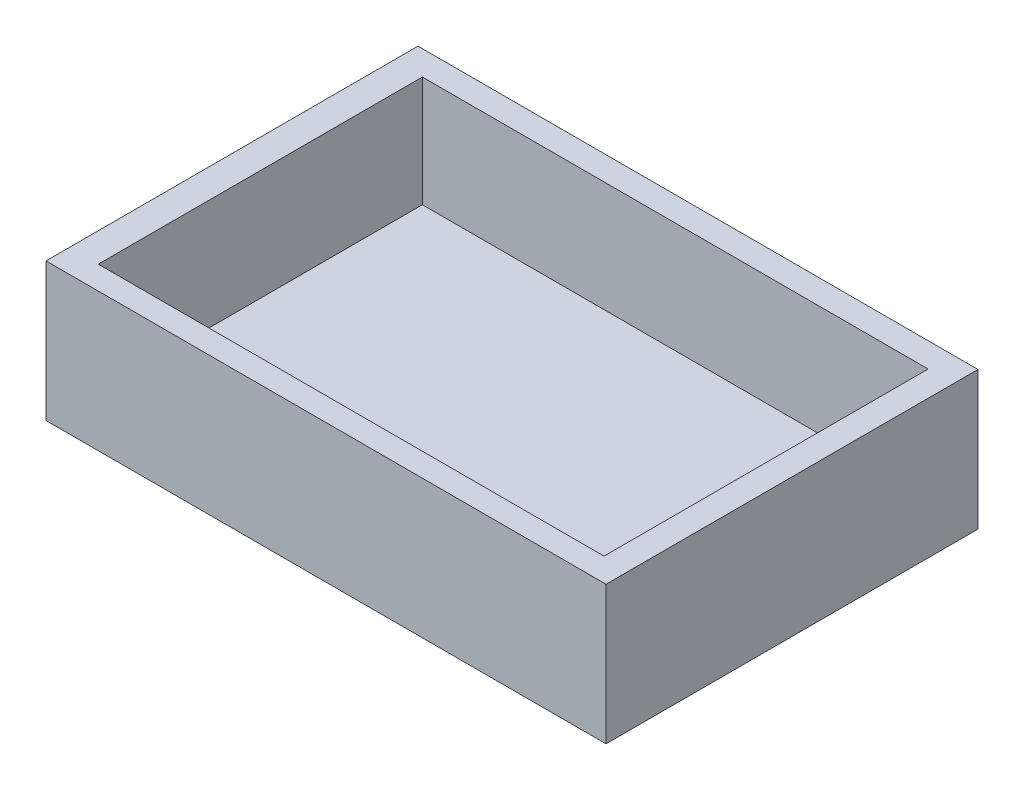
ISO-10303-21;
HEADER;
FILE_DESCRIPTION(('STEP AP214'),'2;1');
FILE_NAME('part.step','',(''),(''),'','','');
FILE_SCHEMA(('AUTOMOTIVE_DESIGN { 1 0 10303 214 1 1 1 1 }'));
ENDSEC;
DATA;
#1=APPLICATION_CONTEXT('core data for automotive mechanical design processes');
#2=APPLICATION_PROTOCOL_DEFINITION('international standard','automotive_design',2000,#1);
#3=PRODUCT_CONTEXT('',#1,'mechanical');
#4=PRODUCT('Part','Part','',(#3));
#5=PRODUCT_RELATED_PRODUCT_CATEGORY('part','',(#4));
#6=PRODUCT_DEFINITION_FORMATION('','',#4);
#7=PRODUCT_DEFINITION_CONTEXT('part definition',#1,'design');
#8=PRODUCT_DEFINITION('design','',#6,#7);
#9=PRODUCT_DEFINITION_SHAPE('','',#8);
#10=(LENGTH_UNIT() NAMED_UNIT(*) SI_UNIT(.MILLI.,.METRE.));
#11=(NAMED_UNIT(*) PLANE_ANGLE_UNIT() SI_UNIT($,.RADIAN.));
#12=(NAMED_UNIT(*) SI_UNIT($,.STERADIAN.) SOLID_ANGLE_UNIT());
#13=UNCERTAINTY_MEASURE_WITH_UNIT(LENGTH_MEASURE(1.E-05),#10,'distance_accuracy_value','');
#14=(GEOMETRIC_REPRESENTATION_CONTEXT(3) GLOBAL_UNCERTAINTY_ASSIGNED_CONTEXT((#13)) GLOBAL_UNIT_ASSIGNED_CONTEXT((#10,
#11,#12)) REPRESENTATION_CONTEXT('',''));
#15=CARTESIAN_POINT('',(0.,0.,0.));
#16=DIRECTION('',(0.,0.,1.));
#17=DIRECTION('',(1.,0.,0.));
#18=AXIS2_PLACEMENT_3D('',#15,#16,#17);
#19=CARTESIAN_POINT('',(-102.508748407959,50.,-57.2112990509311));
#20=DIRECTION('',(1.,0.,0.));
#21=DIRECTION('',(0.,0.,-1.));
#22=AXIS2_PLACEMENT_3D('',#19,#20,#21);
#23=PLANE('',#22);
#24=DIRECTION('',(0.,0.,1.));
#25=VECTOR('',#24,1.);
#26=CARTESIAN_POINT('',(-102.508748407959,0.,-57.2112990509311));
#27=LINE('',#26,#25);
#28=CARTESIAN_POINT('',(-102.508748407959,0.,-57.2112990509311));
#29=VERTEX_POINT('',#28);
#30=CARTESIAN_POINT('',(-102.508748407959,0.,77.3159204093929));
#31=VERTEX_POINT('',#30);
#32=EDGE_CURVE('E145',#29,#31,#27,.T.);
#33=ORIENTED_EDGE('',*,*,#32,.T.);
#34=DIRECTION('',(0.,-1.,0.));
#35=VECTOR('',#34,1.);
#36=CARTESIAN_POINT('',(-102.508748407959,50.,77.3159204093929));
#37=LINE('',#36,#35);
#38=CARTESIAN_POINT('',(-102.508748407959,50.,77.3159204093929));
#39=VERTEX_POINT('',#38);
#40=EDGE_CURVE('E11',#39,#31,#37,.T.);
#41=ORIENTED_EDGE('',*,*,#40,.F.);
#42=DIRECTION('',(0.,0.,1.));
#43=VECTOR('',#42,1.);
#44=CARTESIAN_POINT('',(-102.508748407959,50.,-57.2112990509311));
#45=LINE('',#44,#43);
#46=CARTESIAN_POINT('',(-102.508748407959,50.,-57.2112990509311));
#47=VERTEX_POINT('',#46);
#48=EDGE_CURVE('E149',#47,#39,#45,.T.);
#49=ORIENTED_EDGE('',*,*,#48,.F.);
#50=DIRECTION('',(0.,-1.,0.));
#51=VECTOR('',#50,1.);
#52=CARTESIAN_POINT('',(-102.508748407959,50.,-57.2112990509311));
#53=LINE('',#52,#51);
#54=EDGE_CURVE('E155',#47,#29,#53,.T.);
#55=ORIENTED_EDGE('',*,*,#54,.T.);
#56=EDGE_LOOP('',(#33,#41,#49,#55));
#57=FACE_BOUND('',#56,.T.);
#58=ADVANCED_FACE('F37',(#57),#23,.F.);
#59=CARTESIAN_POINT('',(-102.508748407959,50.,77.3159204093929));
#60=DIRECTION('',(0.,0.,-1.));
#61=DIRECTION('',(-1.,0.,0.));
#62=AXIS2_PLACEMENT_3D('',#59,#60,#61);
#63=PLANE('',#62);
#64=DIRECTION('',(1.,0.,0.));
#65=VECTOR('',#64,1.);
#66=CARTESIAN_POINT('',(-102.508748407959,0.,77.3159204093929));
#67=LINE('',#66,#65);
#68=CARTESIAN_POINT('',(100.026696388396,0.,77.3159204093929));
#69=VERTEX_POINT('',#68);
#70=EDGE_CURVE('E158',#31,#69,#67,.T.);
#71=ORIENTED_EDGE('',*,*,#70,.T.);
#72=DIRECTION('',(0.,-1.,0.));
#73=VECTOR('',#72,1.);
#74=CARTESIAN_POINT('',(100.026696388396,50.,77.3159204093929));
#75=LINE('',#74,#73);
#76=CARTESIAN_POINT('',(100.026696388396,50.,77.3159204093929));
#77=VERTEX_POINT('',#76);
#78=EDGE_CURVE('E44',#77,#69,#75,.T.);
#79=ORIENTED_EDGE('',*,*,#78,.F.);
#80=DIRECTION('',(1.,0.,0.));
#81=VECTOR('',#80,1.);
#82=CARTESIAN_POINT('',(-102.508748407959,50.,77.3159204093929));
#83=LINE('',#82,#81);
#84=EDGE_CURVE('E88',#39,#77,#83,.T.);
#85=ORIENTED_EDGE('',*,*,#84,.F.);
#86=ORIENTED_EDGE('',*,*,#40,.T.);
#87=EDGE_LOOP('',(#71,#79,#85,#86));
#88=FACE_BOUND('',#87,.T.);
#89=ADVANCED_FACE('F187',(#88),#63,.F.);
#90=CARTESIAN_POINT('',(100.026696388396,50.,-57.2112990509311));
#91=DIRECTION('',(-1.,0.,0.));
#92=DIRECTION('',(0.,0.,1.));
#93=AXIS2_PLACEMENT_3D('',#90,#91,#92);
#94=PLANE('',#93);
#95=DIRECTION('',(0.,0.,-1.));
#96=VECTOR('',#95,1.);
#97=CARTESIAN_POINT('',(100.026696388396,0.,-57.2112990509311));
#98=LINE('',#97,#96);
#99=CARTESIAN_POINT('',(100.026696388396,0.,-57.2112990509311));
#100=VERTEX_POINT('',#99);
#101=EDGE_CURVE('E160',#69,#100,#98,.T.);
#102=ORIENTED_EDGE('',*,*,#101,.T.);
#103=DIRECTION('',(0.,-1.,0.));
#104=VECTOR('',#103,1.);
#105=CARTESIAN_POINT('',(100.026696388396,50.,-57.2112990509311));
#106=LINE('',#105,#104);
#107=CARTESIAN_POINT('',(100.026696388396,50.,-57.2112990509311));
#108=VERTEX_POINT('',#107);
#109=EDGE_CURVE('E164',#108,#100,#106,.T.);
#110=ORIENTED_EDGE('',*,*,#109,.F.);
#111=DIRECTION('',(0.,0.,-1.));
#112=VECTOR('',#111,1.);
#113=CARTESIAN_POINT('',(100.026696388396,50.,-57.2112990509311));
#114=LINE('',#113,#112);
#115=EDGE_CURVE('E152',#77,#108,#114,.T.);
#116=ORIENTED_EDGE('',*,*,#115,.F.);
#117=ORIENTED_EDGE('',*,*,#78,.T.);
#118=EDGE_LOOP('',(#102,#110,#116,#117));
#119=FACE_BOUND('',#118,.T.);
#120=ADVANCED_FACE('F169',(#119),#94,.F.);
#121=CARTESIAN_POINT('',(-102.508748407959,50.,-57.2112990509311));
#122=DIRECTION('',(0.,0.,1.));
#123=DIRECTION('',(1.,0.,0.));
#124=AXIS2_PLACEMENT_3D('',#121,#122,#123);
#125=PLANE('',#124);
#126=DIRECTION('',(-1.,0.,0.));
#127=VECTOR('',#126,1.);
#128=CARTESIAN_POINT('',(-102.508748407959,0.,-57.2112990509311));
#129=LINE('',#128,#127);
#130=EDGE_CURVE('E81',#100,#29,#129,.T.);
#131=ORIENTED_EDGE('',*,*,#130,.T.);
#132=ORIENTED_EDGE('',*,*,#54,.F.);
#133=DIRECTION('',(-1.,0.,0.));
#134=VECTOR('',#133,1.);
#135=CARTESIAN_POINT('',(-102.508748407959,50.,-57.2112990509311));
#136=LINE('',#135,#134);
#137=EDGE_CURVE('E60',#108,#47,#136,.T.);
#138=ORIENTED_EDGE('',*,*,#137,.F.);
#139=ORIENTED_EDGE('',*,*,#109,.T.);
#140=EDGE_LOOP('',(#131,#132,#138,#139));
#141=FACE_BOUND('',#140,.T.);
#142=ADVANCED_FACE('F177',(#141),#125,.F.);
#143=CARTESIAN_POINT('',(0.,50.,0.));
#144=DIRECTION('',(0.,1.,0.));
#145=DIRECTION('',(0.,0.,1.));
#146=AXIS2_PLACEMENT_3D('',#143,#144,#145);
#147=PLANE('',#146);
#148=DIRECTION('',(0.,0.,1.));
#149=VECTOR('',#148,1.);
#150=CARTESIAN_POINT('',(-92.0356817227398,50.,-48.3312720208085));
#151=LINE('',#150,#149);
#152=CARTESIAN_POINT('',(-92.0356817227398,50.,-48.3312720208085));
#153=VERTEX_POINT('',#152);
#154=CARTESIAN_POINT('',(-92.0356817227398,50.,68.8724061471207));
#155=VERTEX_POINT('',#154);
#156=EDGE_CURVE('E51',#153,#155,#151,.T.);
#157=ORIENTED_EDGE('',*,*,#156,.F.);
#158=DIRECTION('',(-1.,0.,0.));
#159=VECTOR('',#158,1.);
#160=CARTESIAN_POINT('',(-92.0356817227398,50.,-48.3312720208085));
#161=LINE('',#160,#159);
#162=CARTESIAN_POINT('',(90.8631680067289,50.,-48.3312720208085));
#163=VERTEX_POINT('',#162);
#164=EDGE_CURVE('E130',#163,#153,#161,.T.);
#165=ORIENTED_EDGE('',*,*,#164,.F.);
#166=DIRECTION('',(0.,0.,-1.));
#167=VECTOR('',#166,1.);
#168=CARTESIAN_POINT('',(90.8631680067289,50.,-48.3312720208085));
#169=LINE('',#168,#167);
#170=CARTESIAN_POINT('',(90.8631680067289,50.,68.8724061471207));
#171=VERTEX_POINT('',#170);
#172=EDGE_CURVE('E133',#171,#163,#169,.T.);
#173=ORIENTED_EDGE('',*,*,#172,.F.);
#174=DIRECTION('',(1.,0.,0.));
#175=VECTOR('',#174,1.);
#176=CARTESIAN_POINT('',(-92.0356817227398,50.,68.8724061471207));
#177=LINE('',#176,#175);
#178=EDGE_CURVE('E139',#155,#171,#177,.T.);
#179=ORIENTED_EDGE('',*,*,#178,.F.);
#180=EDGE_LOOP('',(#157,#165,#173,#179));
#181=FACE_BOUND('',#180,.T.);
#182=ORIENTED_EDGE('',*,*,#48,.T.);
#183=ORIENTED_EDGE('',*,*,#84,.T.);
#184=ORIENTED_EDGE('',*,*,#115,.T.);
#185=ORIENTED_EDGE('',*,*,#137,.T.);
#186=EDGE_LOOP('',(#182,#183,#184,#185));
#187=FACE_BOUND('',#186,.T.);
#188=ADVANCED_FACE('F179',(#181,#187),#147,.T.);
#189=CARTESIAN_POINT('',(0.,0.,0.));
#190=DIRECTION('',(0.,1.,0.));
#191=DIRECTION('',(0.,0.,1.));
#192=AXIS2_PLACEMENT_3D('',#189,#190,#191);
#193=PLANE('',#192);
#194=ORIENTED_EDGE('',*,*,#32,.F.);
#195=ORIENTED_EDGE('',*,*,#130,.F.);
#196=ORIENTED_EDGE('',*,*,#101,.F.);
#197=ORIENTED_EDGE('',*,*,#70,.F.);
#198=EDGE_LOOP('',(#194,#195,#196,#197));
#199=FACE_BOUND('',#198,.T.);
#200=ADVANCED_FACE('F173',(#199),#193,.F.);
#201=CARTESIAN_POINT('',(-92.0356817227398,10.,-48.3312720208085));
#202=DIRECTION('',(-1.,0.,0.));
#203=DIRECTION('',(0.,0.,1.));
#204=AXIS2_PLACEMENT_3D('',#201,#202,#203);
#205=PLANE('',#204);
#206=ORIENTED_EDGE('',*,*,#156,.T.);
#207=DIRECTION('',(0.,1.,0.));
#208=VECTOR('',#207,1.);
#209=CARTESIAN_POINT('',(-92.0356817227398,10.,68.8724061471207));
#210=LINE('',#209,#208);
#211=CARTESIAN_POINT('',(-92.0356817227398,10.,68.8724061471207));
#212=VERTEX_POINT('',#211);
#213=EDGE_CURVE('E108',#212,#155,#210,.T.);
#214=ORIENTED_EDGE('',*,*,#213,.F.);
#215=DIRECTION('',(0.,0.,1.));
#216=VECTOR('',#215,1.);
#217=CARTESIAN_POINT('',(-92.0356817227398,10.,-48.3312720208085));
#218=LINE('',#217,#216);
#219=CARTESIAN_POINT('',(-92.0356817227398,10.,-48.3312720208085));
#220=VERTEX_POINT('',#219);
#221=EDGE_CURVE('E112',#220,#212,#218,.T.);
#222=ORIENTED_EDGE('',*,*,#221,.F.);
#223=DIRECTION('',(0.,1.,0.));
#224=VECTOR('',#223,1.);
#225=CARTESIAN_POINT('',(-92.0356817227398,10.,-48.3312720208085));
#226=LINE('',#225,#224);
#227=EDGE_CURVE('E143',#220,#153,#226,.T.);
#228=ORIENTED_EDGE('',*,*,#227,.T.);
#229=EDGE_LOOP('',(#206,#214,#222,#228));
#230=FACE_BOUND('',#229,.T.);
#231=ADVANCED_FACE('F110',(#230),#205,.F.);
#232=CARTESIAN_POINT('',(-92.0356817227398,10.,-48.3312720208085));
#233=DIRECTION('',(0.,0.,-1.));
#234=DIRECTION('',(-1.,0.,0.));
#235=AXIS2_PLACEMENT_3D('',#232,#233,#234);
#236=PLANE('',#235);
#237=ORIENTED_EDGE('',*,*,#164,.T.);
#238=ORIENTED_EDGE('',*,*,#227,.F.);
#239=DIRECTION('',(-1.,0.,0.));
#240=VECTOR('',#239,1.);
#241=CARTESIAN_POINT('',(-92.0356817227398,10.,-48.3312720208085));
#242=LINE('',#241,#240);
#243=CARTESIAN_POINT('',(90.8631680067289,10.,-48.3312720208085));
#244=VERTEX_POINT('',#243);
#245=EDGE_CURVE('E118',#244,#220,#242,.T.);
#246=ORIENTED_EDGE('',*,*,#245,.F.);
#247=DIRECTION('',(0.,1.,0.));
#248=VECTOR('',#247,1.);
#249=CARTESIAN_POINT('',(90.8631680067289,10.,-48.3312720208085));
#250=LINE('',#249,#248);
#251=EDGE_CURVE('E146',#244,#163,#250,.T.);
#252=ORIENTED_EDGE('',*,*,#251,.T.);
#253=EDGE_LOOP('',(#237,#238,#246,#252));
#254=FACE_BOUND('',#253,.T.);
#255=ADVANCED_FACE('F230',(#254),#236,.F.);
#256=CARTESIAN_POINT('',(90.8631680067289,10.,-48.3312720208085));
#257=DIRECTION('',(1.,0.,0.));
#258=DIRECTION('',(0.,0.,-1.));
#259=AXIS2_PLACEMENT_3D('',#256,#257,#258);
#260=PLANE('',#259);
#261=ORIENTED_EDGE('',*,*,#172,.T.);
#262=ORIENTED_EDGE('',*,*,#251,.F.);
#263=DIRECTION('',(0.,0.,-1.));
#264=VECTOR('',#263,1.);
#265=CARTESIAN_POINT('',(90.8631680067289,10.,-48.3312720208085));
#266=LINE('',#265,#264);
#267=CARTESIAN_POINT('',(90.8631680067289,10.,68.8724061471207));
#268=VERTEX_POINT('',#267);
#269=EDGE_CURVE('E126',#268,#244,#266,.T.);
#270=ORIENTED_EDGE('',*,*,#269,.F.);
#271=DIRECTION('',(0.,1.,0.));
#272=VECTOR('',#271,1.);
#273=CARTESIAN_POINT('',(90.8631680067289,10.,68.8724061471207));
#274=LINE('',#273,#272);
#275=EDGE_CURVE('E117',#268,#171,#274,.T.);
#276=ORIENTED_EDGE('',*,*,#275,.T.);
#277=EDGE_LOOP('',(#261,#262,#270,#276));
#278=FACE_BOUND('',#277,.T.);
#279=ADVANCED_FACE('F240',(#278),#260,.F.);
#280=CARTESIAN_POINT('',(-92.0356817227398,10.,68.8724061471207));
#281=DIRECTION('',(0.,0.,1.));
#282=DIRECTION('',(1.,0.,0.));
#283=AXIS2_PLACEMENT_3D('',#280,#281,#282);
#284=PLANE('',#283);
#285=ORIENTED_EDGE('',*,*,#178,.T.);
#286=ORIENTED_EDGE('',*,*,#275,.F.);
#287=DIRECTION('',(1.,0.,0.));
#288=VECTOR('',#287,1.);
#289=CARTESIAN_POINT('',(-92.0356817227398,10.,68.8724061471207));
#290=LINE('',#289,#288);
#291=EDGE_CURVE('E121',#212,#268,#290,.T.);
#292=ORIENTED_EDGE('',*,*,#291,.F.);
#293=ORIENTED_EDGE('',*,*,#213,.T.);
#294=EDGE_LOOP('',(#285,#286,#292,#293));
#295=FACE_BOUND('',#294,.T.);
#296=ADVANCED_FACE('F122',(#295),#284,.F.);
#297=CARTESIAN_POINT('',(0.,10.,0.));
#298=DIRECTION('',(0.,1.,0.));
#299=DIRECTION('',(0.,0.,1.));
#300=AXIS2_PLACEMENT_3D('',#297,#298,#299);
#301=PLANE('',#300);
#302=ORIENTED_EDGE('',*,*,#221,.T.);
#303=ORIENTED_EDGE('',*,*,#291,.T.);
#304=ORIENTED_EDGE('',*,*,#269,.T.);
#305=ORIENTED_EDGE('',*,*,#245,.T.);
#306=EDGE_LOOP('',(#302,#303,#304,#305));
#307=FACE_BOUND('',#306,.T.);
#308=ADVANCED_FACE('F128',(#307),#301,.T.);
#309=CLOSED_SHELL('',(#58,#89,#120,#142,#188,#200,#231,#255,#279,#296,#308));
#310=MANIFOLD_SOLID_BREP('B2',#309);
#311=ADVANCED_BREP_SHAPE_REPRESENTATION('',(#18,#310),#14);
#312=SHAPE_DEFINITION_REPRESENTATION(#9,#311);
ENDSEC;
END-ISO-10303-21;
